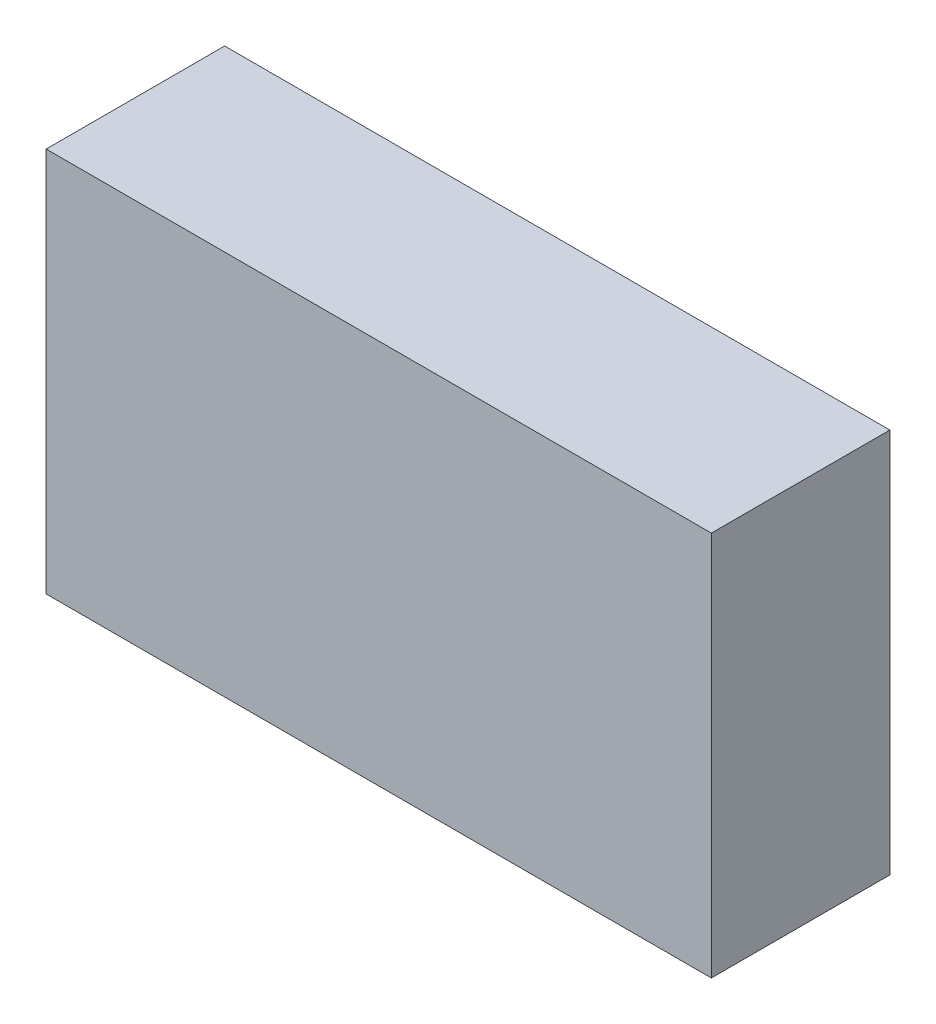
ISO-10303-21;
HEADER;
FILE_DESCRIPTION(('STEP AP214'),'2;1');
FILE_NAME('part.step','',(''),(''),'','','');
FILE_SCHEMA(('AUTOMOTIVE_DESIGN { 1 0 10303 214 1 1 1 1 }'));
ENDSEC;
DATA;
#1=APPLICATION_CONTEXT('core data for automotive mechanical design processes');
#2=APPLICATION_PROTOCOL_DEFINITION('international standard','automotive_design',2000,#1);
#3=PRODUCT_CONTEXT('',#1,'mechanical');
#4=PRODUCT('Part','Part','',(#3));
#5=PRODUCT_RELATED_PRODUCT_CATEGORY('part','',(#4));
#6=PRODUCT_DEFINITION_FORMATION('','',#4);
#7=PRODUCT_DEFINITION_CONTEXT('part definition',#1,'design');
#8=PRODUCT_DEFINITION('design','',#6,#7);
#9=PRODUCT_DEFINITION_SHAPE('','',#8);
#10=(LENGTH_UNIT() NAMED_UNIT(*) SI_UNIT(.MILLI.,.METRE.));
#11=(NAMED_UNIT(*) PLANE_ANGLE_UNIT() SI_UNIT($,.RADIAN.));
#12=(NAMED_UNIT(*) SI_UNIT($,.STERADIAN.) SOLID_ANGLE_UNIT());
#13=UNCERTAINTY_MEASURE_WITH_UNIT(LENGTH_MEASURE(1.E-05),#10,'distance_accuracy_value','');
#14=(GEOMETRIC_REPRESENTATION_CONTEXT(3) GLOBAL_UNCERTAINTY_ASSIGNED_CONTEXT((#13)) GLOBAL_UNIT_ASSIGNED_CONTEXT((#10,
#11,#12)) REPRESENTATION_CONTEXT('',''));
#15=CARTESIAN_POINT('',(0.,0.,0.));
#16=DIRECTION('',(0.,0.,1.));
#17=DIRECTION('',(1.,0.,0.));
#18=AXIS2_PLACEMENT_3D('',#15,#16,#17);
#19=CARTESIAN_POINT('',(25.569999798474,28.999997999929,0.495));
#20=DIRECTION('',(0.,0.,1.));
#21=DIRECTION('',(1.,0.,0.));
#22=AXIS2_PLACEMENT_3D('',#19,#20,#21);
#23=PLANE('',#22);
#24=DIRECTION('',(8.74227765734797E-08,-0.999999999999996,0.));
#25=VECTOR('',#24,1.);
#26=CARTESIAN_POINT('',(23.929999798474,28.999997856556,0.495));
#27=LINE('',#26,#25);
#28=CARTESIAN_POINT('',(23.9299998399999,28.0499978565559,0.495));
#29=VERTEX_POINT('',#28);
#30=CARTESIAN_POINT('',(23.929999798474,28.9999978923991,0.495));
#31=VERTEX_POINT('',#30);
#32=EDGE_CURVE('E76',#29,#31,#27,.F.);
#33=ORIENTED_EDGE('',*,*,#32,.F.);
#34=DIRECTION('',(0.999999999999996,8.74227765734797E-08,0.));
#35=VECTOR('',#34,1.);
#36=CARTESIAN_POINT('',(25.569999881526,28.049997999929,0.495));
#37=LINE('',#36,#35);
#38=CARTESIAN_POINT('',(25.5699998815258,28.0499979640857,0.495));
#39=VERTEX_POINT('',#38);
#40=EDGE_CURVE('E58',#39,#29,#37,.F.);
#41=ORIENTED_EDGE('',*,*,#40,.F.);
#42=DIRECTION('',(8.74227765734797E-08,-0.999999999999996,0.));
#43=VECTOR('',#42,1.);
#44=CARTESIAN_POINT('',(25.569999798474,28.999997999929,0.495));
#45=LINE('',#44,#43);
#46=CARTESIAN_POINT('',(25.569999819237,28.999997999929,0.495));
#47=VERTEX_POINT('',#46);
#48=EDGE_CURVE('E20',#39,#47,#45,.F.);
#49=ORIENTED_EDGE('',*,*,#48,.T.);
#50=DIRECTION('',(0.999999999999996,8.74227765734797E-08,0.));
#51=VECTOR('',#50,1.);
#52=CARTESIAN_POINT('',(25.569999798474,28.999997999929,0.495));
#53=LINE('',#52,#51);
#54=EDGE_CURVE('E55',#47,#31,#53,.F.);
#55=ORIENTED_EDGE('',*,*,#54,.T.);
#56=EDGE_LOOP('',(#33,#41,#49,#55));
#57=FACE_BOUND('',#56,.T.);
#58=ADVANCED_FACE('F17',(#57),#23,.T.);
#59=CARTESIAN_POINT('',(25.569999798474,28.999997999929,0.055));
#60=DIRECTION('',(-0.999999999999996,-8.74227765734797E-08,0.));
#61=DIRECTION('',(8.74227765734797E-08,-0.999999999999996,0.));
#62=AXIS2_PLACEMENT_3D('',#59,#60,#61);
#63=PLANE('',#62);
#64=DIRECTION('',(0.,0.,1.));
#65=VECTOR('',#64,1.);
#66=CARTESIAN_POINT('',(25.569999881526,28.049997999929,0.055));
#67=LINE('',#66,#65);
#68=CARTESIAN_POINT('',(25.5699998815258,28.0499979640857,0.055));
#69=VERTEX_POINT('',#68);
#70=EDGE_CURVE('E78',#69,#39,#67,.T.);
#71=ORIENTED_EDGE('',*,*,#70,.F.);
#72=DIRECTION('',(0.,1.,0.));
#73=VECTOR('',#72,1.);
#74=CARTESIAN_POINT('',(25.569999881526,28.999997999929,0.055));
#75=LINE('',#74,#73);
#76=CARTESIAN_POINT('',(25.569999819237,28.999997999929,0.055));
#77=VERTEX_POINT('',#76);
#78=EDGE_CURVE('E73',#69,#77,#75,.T.);
#79=ORIENTED_EDGE('',*,*,#78,.T.);
#80=DIRECTION('',(0.,0.,1.));
#81=VECTOR('',#80,1.);
#82=CARTESIAN_POINT('',(25.569999798474,28.999997999929,0.055));
#83=LINE('',#82,#81);
#84=EDGE_CURVE('E63',#77,#47,#83,.T.);
#85=ORIENTED_EDGE('',*,*,#84,.T.);
#86=ORIENTED_EDGE('',*,*,#48,.F.);
#87=EDGE_LOOP('',(#71,#79,#85,#86));
#88=FACE_BOUND('',#87,.T.);
#89=ADVANCED_FACE('F72',(#88),#63,.F.);
#90=CARTESIAN_POINT('',(25.569999798474,28.999997999929,0.055));
#91=DIRECTION('',(8.74227765734797E-08,-0.999999999999996,0.));
#92=DIRECTION('',(0.999999999999996,8.74227765734797E-08,0.));
#93=AXIS2_PLACEMENT_3D('',#90,#91,#92);
#94=PLANE('',#93);
#95=ORIENTED_EDGE('',*,*,#54,.F.);
#96=ORIENTED_EDGE('',*,*,#84,.F.);
#97=DIRECTION('',(1.,0.,0.));
#98=VECTOR('',#97,1.);
#99=CARTESIAN_POINT('',(25.569999798474,28.999997999929,0.055));
#100=LINE('',#99,#98);
#101=CARTESIAN_POINT('',(23.929999798474,28.9999978923991,0.055));
#102=VERTEX_POINT('',#101);
#103=EDGE_CURVE('E83',#77,#102,#100,.F.);
#104=ORIENTED_EDGE('',*,*,#103,.T.);
#105=DIRECTION('',(0.,0.,1.));
#106=VECTOR('',#105,1.);
#107=CARTESIAN_POINT('',(23.929999798474,28.999997856556,0.055));
#108=LINE('',#107,#106);
#109=EDGE_CURVE('E69',#31,#102,#108,.F.);
#110=ORIENTED_EDGE('',*,*,#109,.F.);
#111=EDGE_LOOP('',(#95,#96,#104,#110));
#112=FACE_BOUND('',#111,.T.);
#113=ADVANCED_FACE('F66',(#112),#94,.F.);
#114=CARTESIAN_POINT('',(23.929999798474,28.999997856556,0.055));
#115=DIRECTION('',(-0.999999999999996,-8.74227765734797E-08,0.));
#116=DIRECTION('',(8.74227765734797E-08,-0.999999999999996,0.));
#117=AXIS2_PLACEMENT_3D('',#114,#115,#116);
#118=PLANE('',#117);
#119=DIRECTION('',(0.,0.,1.));
#120=VECTOR('',#119,1.);
#121=CARTESIAN_POINT('',(23.929999881526,28.0499978565556,0.055));
#122=LINE('',#121,#120);
#123=CARTESIAN_POINT('',(23.9299998607628,28.0499978565559,0.055));
#124=VERTEX_POINT('',#123);
#125=EDGE_CURVE('E34',#29,#124,#122,.F.);
#126=ORIENTED_EDGE('',*,*,#125,.F.);
#127=ORIENTED_EDGE('',*,*,#32,.T.);
#128=ORIENTED_EDGE('',*,*,#109,.T.);
#129=DIRECTION('',(0.,1.,0.));
#130=VECTOR('',#129,1.);
#131=CARTESIAN_POINT('',(23.929999798474,28.999997999929,0.055));
#132=LINE('',#131,#130);
#133=EDGE_CURVE('E26',#102,#124,#132,.F.);
#134=ORIENTED_EDGE('',*,*,#133,.T.);
#135=EDGE_LOOP('',(#126,#127,#128,#134));
#136=FACE_BOUND('',#135,.T.);
#137=ADVANCED_FACE('F88',(#136),#118,.T.);
#138=CARTESIAN_POINT('',(25.569999881526,28.049997999929,0.055));
#139=DIRECTION('',(8.74227765734797E-08,-0.999999999999996,0.));
#140=DIRECTION('',(0.999999999999996,8.74227765734797E-08,0.));
#141=AXIS2_PLACEMENT_3D('',#138,#139,#140);
#142=PLANE('',#141);
#143=ORIENTED_EDGE('',*,*,#40,.T.);
#144=ORIENTED_EDGE('',*,*,#125,.T.);
#145=DIRECTION('',(1.,0.,0.));
#146=VECTOR('',#145,1.);
#147=CARTESIAN_POINT('',(25.569999798474,28.049997856556,0.055));
#148=LINE('',#147,#146);
#149=EDGE_CURVE('E11',#124,#69,#148,.T.);
#150=ORIENTED_EDGE('',*,*,#149,.T.);
#151=ORIENTED_EDGE('',*,*,#70,.T.);
#152=EDGE_LOOP('',(#143,#144,#150,#151));
#153=FACE_BOUND('',#152,.T.);
#154=ADVANCED_FACE('F91',(#153),#142,.T.);
#155=CARTESIAN_POINT('',(25.569999798474,28.999997999929,0.055));
#156=DIRECTION('',(0.,0.,1.));
#157=DIRECTION('',(1.,0.,0.));
#158=AXIS2_PLACEMENT_3D('',#155,#156,#157);
#159=PLANE('',#158);
#160=ORIENTED_EDGE('',*,*,#133,.F.);
#161=ORIENTED_EDGE('',*,*,#103,.F.);
#162=ORIENTED_EDGE('',*,*,#78,.F.);
#163=ORIENTED_EDGE('',*,*,#149,.F.);
#164=EDGE_LOOP('',(#160,#161,#162,#163));
#165=FACE_BOUND('',#164,.T.);
#166=ADVANCED_FACE('F90',(#165),#159,.F.);
#167=CLOSED_SHELL('',(#58,#89,#113,#137,#154,#166));
#168=MANIFOLD_SOLID_BREP('B1',#167);
#169=ADVANCED_BREP_SHAPE_REPRESENTATION('',(#18,#168),#14);
#170=SHAPE_DEFINITION_REPRESENTATION(#9,#169);
ENDSEC;
END-ISO-10303-21;
